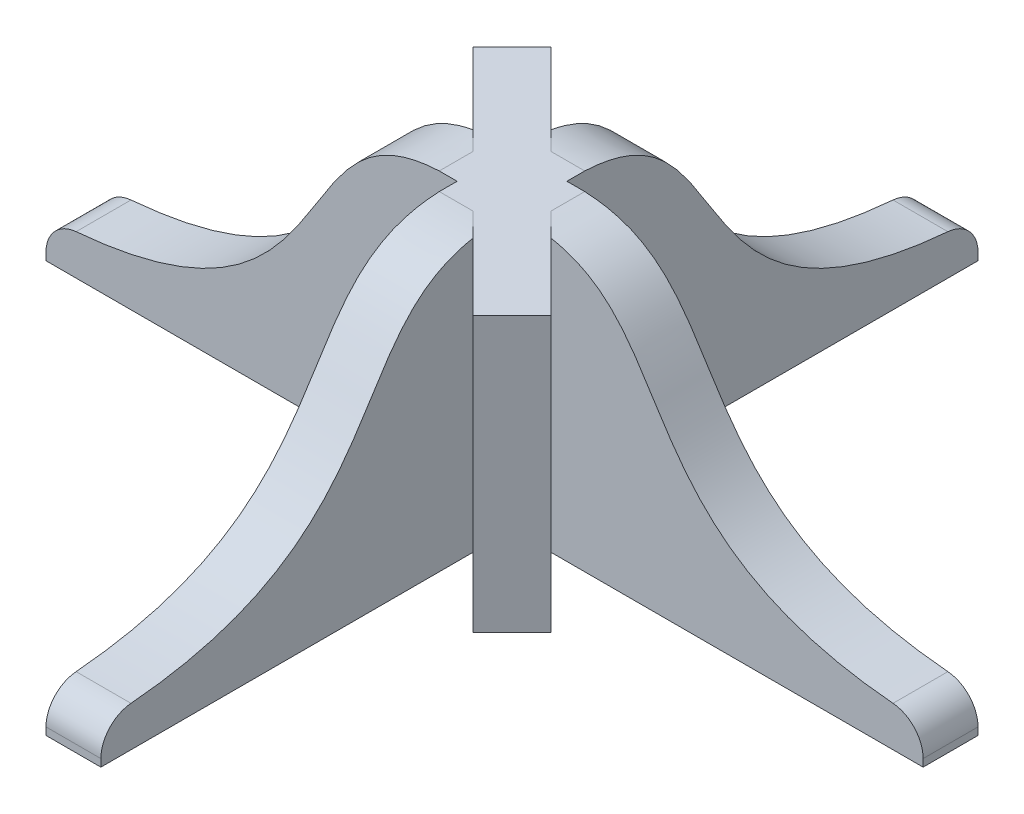
ISO-10303-21;
HEADER;
FILE_DESCRIPTION(('STEP AP214'),'2;1');
FILE_NAME('part.step','',(''),(''),'','','');
FILE_SCHEMA(('AUTOMOTIVE_DESIGN { 1 0 10303 214 1 1 1 1 }'));
ENDSEC;
DATA;
#1=APPLICATION_CONTEXT('core data for automotive mechanical design processes');
#2=APPLICATION_PROTOCOL_DEFINITION('international standard','automotive_design',2000,#1);
#3=PRODUCT_CONTEXT('',#1,'mechanical');
#4=PRODUCT('Part','Part','',(#3));
#5=PRODUCT_RELATED_PRODUCT_CATEGORY('part','',(#4));
#6=PRODUCT_DEFINITION_FORMATION('','',#4);
#7=PRODUCT_DEFINITION_CONTEXT('part definition',#1,'design');
#8=PRODUCT_DEFINITION('design','',#6,#7);
#9=PRODUCT_DEFINITION_SHAPE('','',#8);
#10=(LENGTH_UNIT() NAMED_UNIT(*) SI_UNIT(.MILLI.,.METRE.));
#11=(NAMED_UNIT(*) PLANE_ANGLE_UNIT() SI_UNIT($,.RADIAN.));
#12=(NAMED_UNIT(*) SI_UNIT($,.STERADIAN.) SOLID_ANGLE_UNIT());
#13=UNCERTAINTY_MEASURE_WITH_UNIT(LENGTH_MEASURE(1.E-05),#10,'distance_accuracy_value','');
#14=(GEOMETRIC_REPRESENTATION_CONTEXT(3) GLOBAL_UNCERTAINTY_ASSIGNED_CONTEXT((#13)) GLOBAL_UNIT_ASSIGNED_CONTEXT((#10,
#11,#12)) REPRESENTATION_CONTEXT('',''));
#15=CARTESIAN_POINT('',(0.,0.,0.));
#16=DIRECTION('',(0.,0.,1.));
#17=DIRECTION('',(1.,0.,0.));
#18=AXIS2_PLACEMENT_3D('',#15,#16,#17);
#19=CARTESIAN_POINT('',(2.5,25.,15.));
#20=DIRECTION('',(-1.,0.,0.));
#21=DIRECTION('',(0.,0.,1.));
#22=AXIS2_PLACEMENT_3D('',#19,#20,#21);
#23=PLANE('',#22);
#24=DIRECTION('',(0.,1.,0.));
#25=VECTOR('',#24,1.);
#26=CARTESIAN_POINT('',(2.5,0.,-39.9545926495664));
#27=LINE('',#26,#25);
#28=CARTESIAN_POINT('',(2.5,0.,-39.9545926495664));
#29=VERTEX_POINT('',#28);
#30=CARTESIAN_POINT('',(2.5,0.677844254713842,-39.9545926495664));
#31=VERTEX_POINT('',#30);
#32=EDGE_CURVE('E424',#29,#31,#27,.T.);
#33=ORIENTED_EDGE('',*,*,#32,.T.);
#34=CARTESIAN_POINT('',(2.5,0.677844254713842,-36.9545926495664));
#35=DIRECTION('',(-1.,0.,0.));
#36=DIRECTION('',(0.,0.,1.));
#37=AXIS2_PLACEMENT_3D('',#34,#35,#36);
#38=CIRCLE('',#37,3.);
#39=CARTESIAN_POINT('',(2.5,3.66674252680247,-37.2124436125384));
#40=VERTEX_POINT('',#39);
#41=EDGE_CURVE('E580',#31,#40,#38,.F.);
#42=ORIENTED_EDGE('',*,*,#41,.T.);
#43=CARTESIAN_POINT('',(2.5,3.5,-39.9545926495664));
#44=CARTESIAN_POINT('',(2.5,4.59068781406489,-10.398907099997));
#45=CARTESIAN_POINT('',(2.5,25.7140022080052,-19.5925722624361));
#46=CARTESIAN_POINT('',(2.5,25.,-2.49999999999992));
#47=B_SPLINE_CURVE_WITH_KNOTS('',3,(#43,#44,#45,#46),.UNSPECIFIED.,.F.,.F.,(4,4),(0.,1.),.UNSPECIFIED.);
#48=CARTESIAN_POINT('',(2.5,25.,-4.12758132705395));
#49=VERTEX_POINT('',#48);
#50=EDGE_CURVE('E423',#40,#49,#47,.T.);
#51=ORIENTED_EDGE('',*,*,#50,.T.);
#52=DIRECTION('',(0.,0.,-1.));
#53=VECTOR('',#52,1.);
#54=CARTESIAN_POINT('',(2.5,25.,0.));
#55=LINE('',#54,#53);
#56=CARTESIAN_POINT('',(2.5,25.,-2.5));
#57=VERTEX_POINT('',#56);
#58=EDGE_CURVE('E630',#57,#49,#55,.T.);
#59=ORIENTED_EDGE('',*,*,#58,.F.);
#60=DIRECTION('',(0.,1.,0.));
#61=VECTOR('',#60,1.);
#62=CARTESIAN_POINT('',(2.5,25.,-2.50000000000001));
#63=LINE('',#62,#61);
#64=CARTESIAN_POINT('',(2.5,0.,-2.5));
#65=VERTEX_POINT('',#64);
#66=EDGE_CURVE('E364',#65,#57,#63,.T.);
#67=ORIENTED_EDGE('',*,*,#66,.F.);
#68=DIRECTION('',(0.,0.,-1.));
#69=VECTOR('',#68,1.);
#70=CARTESIAN_POINT('',(2.5,0.,0.));
#71=LINE('',#70,#69);
#72=EDGE_CURVE('E640',#65,#29,#71,.T.);
#73=ORIENTED_EDGE('',*,*,#72,.T.);
#74=EDGE_LOOP('',(#33,#42,#51,#59,#67,#73));
#75=FACE_BOUND('',#74,.T.);
#76=ADVANCED_FACE('F136',(#75),#23,.F.);
#77=CARTESIAN_POINT('',(-1.76776695296637,0.,1.76776695296637));
#78=DIRECTION('',(-0.707106781186546,0.,0.707106781186549));
#79=DIRECTION('',(0.707106781186549,0.,0.707106781186546));
#80=AXIS2_PLACEMENT_3D('',#77,#78,#79);
#81=PLANE('',#80);
#82=DIRECTION('',(0.707106781186549,0.,0.707106781186546));
#83=VECTOR('',#82,1.);
#84=CARTESIAN_POINT('',(-12.3743686707646,0.,-8.83883476483182));
#85=LINE('',#84,#83);
#86=CARTESIAN_POINT('',(-12.3743686707646,0.,-8.83883476483182));
#87=VERTEX_POINT('',#86);
#88=CARTESIAN_POINT('',(-6.03553390593273,0.,-2.49999999999998));
#89=VERTEX_POINT('',#88);
#90=EDGE_CURVE('E375',#87,#89,#85,.T.);
#91=ORIENTED_EDGE('',*,*,#90,.T.);
#92=DIRECTION('',(0.,1.,0.));
#93=VECTOR('',#92,1.);
#94=CARTESIAN_POINT('',(-6.03553390593273,0.,-2.49999999999998));
#95=LINE('',#94,#93);
#96=CARTESIAN_POINT('',(-6.03553390989269,24.7911321666375,-2.49999999999998));
#97=VERTEX_POINT('',#96);
#98=EDGE_CURVE('E572',#89,#97,#95,.T.);
#99=ORIENTED_EDGE('',*,*,#98,.T.);
#100=CARTESIAN_POINT('',(-4.12758132690589,25.0000000000034,-0.592047420972992));
#101=CARTESIAN_POINT('',(-4.20734316558826,24.9963843751637,-0.671809259655455));
#102=CARTESIAN_POINT('',(-4.28709231995216,24.9921929748728,-0.751558414019398));
#103=CARTESIAN_POINT('',(-4.44652290779908,24.9826163361146,-0.910989001866349));
#104=CARTESIAN_POINT('',(-4.52620435560341,24.9772315737387,-0.990670449670671));
#105=CARTESIAN_POINT('',(-4.68549810718278,24.965224818639,-1.14996420125003));
#106=CARTESIAN_POINT('',(-4.76511042416571,24.9586031776077,-1.22957651823296));
#107=CARTESIAN_POINT('',(-4.92426412870012,24.9440766412828,-1.38873022276737));
#108=CARTESIAN_POINT('',(-5.00380552538779,24.9361719465794,-1.46827161945504));
#109=CARTESIAN_POINT('',(-5.16281982317982,24.9190306332631,-1.62728591724707));
#110=CARTESIAN_POINT('',(-5.24229272146655,24.9097939622663,-1.7067588155338));
#111=CARTESIAN_POINT('',(-5.40116226751207,24.8899384936853,-1.86562836157932));
#112=CARTESIAN_POINT('',(-5.48055890451985,24.8793195237965,-1.94502499858709));
#113=CARTESIAN_POINT('',(-5.63927225334025,24.8566466111186,-2.1037383474075));
#114=CARTESIAN_POINT('',(-5.71858893671162,24.8445922692379,-2.18305503077886));
#115=CARTESIAN_POINT('',(-5.87713808017222,24.818992893705,-2.34160417423947));
#116=CARTESIAN_POINT('',(-5.95637048615244,24.8054471902862,-2.4208365802197));
#117=CARTESIAN_POINT('',(-6.03553390990431,24.7911321666354,-2.50000000397158));
#118=B_SPLINE_CURVE_WITH_KNOTS('',3,(#100,#101,#102,#103,#104,#105,#106,#107,#108,#109,#110,
#111,#112,#113,#114,#115,#116,#117),.UNSPECIFIED.,.F.,.F.,(4,2,2,2,2,2,2,2,4),(0.,
0.338573908695255,0.677012985757939,1.0153559775485,1.35364612430561,1.69194957893252,
2.03029524375751,2.36873520299648,2.7073277795596),.UNSPECIFIED.);
#119=CARTESIAN_POINT('',(-4.12758132690581,25.,-0.592047420973067));
#120=VERTEX_POINT('',#119);
#121=EDGE_CURVE('E565',#120,#97,#118,.T.);
#122=ORIENTED_EDGE('',*,*,#121,.F.);
#123=DIRECTION('',(-0.707106781186549,0.,-0.707106781186546));
#124=VECTOR('',#123,1.);
#125=CARTESIAN_POINT('',(-12.3743686707646,25.,-8.83883476483182));
#126=LINE('',#125,#124);
#127=CARTESIAN_POINT('',(-12.3743686707646,25.,-8.83883476483182));
#128=VERTEX_POINT('',#127);
#129=EDGE_CURVE('E324',#120,#128,#126,.T.);
#130=ORIENTED_EDGE('',*,*,#129,.T.);
#131=DIRECTION('',(0.,-1.,0.));
#132=VECTOR('',#131,1.);
#133=CARTESIAN_POINT('',(-12.3743686707646,25.,-8.83883476483182));
#134=LINE('',#133,#132);
#135=EDGE_CURVE('E369',#128,#87,#134,.T.);
#136=ORIENTED_EDGE('',*,*,#135,.T.);
#137=EDGE_LOOP('',(#91,#99,#122,#130,#136));
#138=FACE_BOUND('',#137,.T.);
#139=ADVANCED_FACE('F500',(#138),#81,.T.);
#140=CARTESIAN_POINT('',(-2.5,25.,15.));
#141=DIRECTION('',(-1.,0.,0.));
#142=DIRECTION('',(0.,0.,1.));
#143=AXIS2_PLACEMENT_3D('',#140,#141,#142);
#144=PLANE('',#143);
#145=CARTESIAN_POINT('',(-2.5,3.5,-39.9545926495664));
#146=CARTESIAN_POINT('',(-2.5,4.59068781406489,-10.398907099997));
#147=CARTESIAN_POINT('',(-2.5,25.7140022080052,-19.5925722624361));
#148=CARTESIAN_POINT('',(-2.5,25.,-2.49999999999992));
#149=B_SPLINE_CURVE_WITH_KNOTS('',3,(#145,#146,#147,#148),.UNSPECIFIED.,.F.,.F.,(4,4),(0.,1.),.UNSPECIFIED.);
#150=CARTESIAN_POINT('',(-2.5,3.66674252680247,-37.2124436125384));
#151=VERTEX_POINT('',#150);
#152=CARTESIAN_POINT('',(-2.50000000197772,24.7911321659231,-6.03553391186589));
#153=VERTEX_POINT('',#152);
#154=EDGE_CURVE('E433',#151,#153,#149,.T.);
#155=ORIENTED_EDGE('',*,*,#154,.F.);
#156=CARTESIAN_POINT('',(-2.5,0.677844254713842,-36.9545926495664));
#157=DIRECTION('',(-1.,0.,0.));
#158=DIRECTION('',(0.,0.,1.));
#159=AXIS2_PLACEMENT_3D('',#156,#157,#158);
#160=CIRCLE('',#159,3.);
#161=CARTESIAN_POINT('',(-2.5,0.677844254713842,-39.9545926495664));
#162=VERTEX_POINT('',#161);
#163=EDGE_CURVE('E586',#151,#162,#160,.T.);
#164=ORIENTED_EDGE('',*,*,#163,.T.);
#165=DIRECTION('',(0.,1.,0.));
#166=VECTOR('',#165,1.);
#167=CARTESIAN_POINT('',(-2.5,0.,-39.9545926495664));
#168=LINE('',#167,#166);
#169=CARTESIAN_POINT('',(-2.5,0.,-39.9545926495664));
#170=VERTEX_POINT('',#169);
#171=EDGE_CURVE('E442',#170,#162,#168,.T.);
#172=ORIENTED_EDGE('',*,*,#171,.F.);
#173=DIRECTION('',(0.,0.,-1.));
#174=VECTOR('',#173,1.);
#175=CARTESIAN_POINT('',(-2.5,0.,0.));
#176=LINE('',#175,#174);
#177=CARTESIAN_POINT('',(-2.5,0.,-6.03553390593273));
#178=VERTEX_POINT('',#177);
#179=EDGE_CURVE('E646',#178,#170,#176,.T.);
#180=ORIENTED_EDGE('',*,*,#179,.F.);
#181=DIRECTION('',(0.,1.,0.));
#182=VECTOR('',#181,1.);
#183=CARTESIAN_POINT('',(-2.5,25.,-6.03553390593272));
#184=LINE('',#183,#182);
#185=EDGE_CURVE('E415',#178,#153,#184,.T.);
#186=ORIENTED_EDGE('',*,*,#185,.T.);
#187=EDGE_LOOP('',(#155,#164,#172,#180,#186));
#188=FACE_BOUND('',#187,.T.);
#189=ADVANCED_FACE('F467',(#188),#144,.T.);
#190=CARTESIAN_POINT('',(-32.897536702704,3.5,-39.9545926495664));
#191=CARTESIAN_POINT('',(-32.897536702704,4.59068781406489,-10.398907099997));
#192=CARTESIAN_POINT('',(-32.897536702704,25.7140022080052,-19.5925722624361));
#193=CARTESIAN_POINT('',(-32.897536702704,25.,-2.49999999999992));
#194=B_SPLINE_CURVE_WITH_KNOTS('',3,(#190,#191,#192,#193),.UNSPECIFIED.,.F.,.F.,(4,4),(0.,1.),.UNSPECIFIED.);
#195=DIRECTION('',(1.,0.,0.));
#196=VECTOR('',#195,1.);
#197=SURFACE_OF_LINEAR_EXTRUSION('',#194,#196);
#198=ORIENTED_EDGE('',*,*,#50,.F.);
#199=DIRECTION('',(1.,0.,0.));
#200=VECTOR('',#199,1.);
#201=CARTESIAN_POINT('',(2.5,3.66674252680247,-37.2124436125384));
#202=LINE('',#201,#200);
#203=EDGE_CURVE('E583',#40,#151,#202,.F.);
#204=ORIENTED_EDGE('',*,*,#203,.T.);
#205=ORIENTED_EDGE('',*,*,#154,.T.);
#206=CARTESIAN_POINT('',(-2.50000000197772,24.7911321659231,-6.03553391186589));
#207=CARTESIAN_POINT('',(-2.42083657959755,24.8054471900138,-5.95637048695043));
#208=CARTESIAN_POINT('',(-2.34160417421857,24.8189928936075,-5.87713808053174));
#209=CARTESIAN_POINT('',(-2.18305503128428,24.8445922692571,-5.71858893683673));
#210=CARTESIAN_POINT('',(-2.10373834783829,24.8566466110799,-5.63927225366913));
#211=CARTESIAN_POINT('',(-1.9450249990506,24.8793195237074,-5.48055890508518));
#212=CARTESIAN_POINT('',(-1.86562836215011,24.8899384936035,-5.40116226811012));
#213=CARTESIAN_POINT('',(-1.70675881627052,24.9097939621847,-5.24229272217596));
#214=CARTESIAN_POINT('',(-1.62728591804243,24.9190306331742,-5.16281982396784));
#215=CARTESIAN_POINT('',(-1.46827162038159,24.9361719464826,-5.00380552632163));
#216=CARTESIAN_POINT('',(-1.38873022376646,24.9440766411854,-4.92426412970115));
#217=CARTESIAN_POINT('',(-1.22957651937324,24.9586031775099,-4.765110425304));
#218=CARTESIAN_POINT('',(-1.14996420245896,24.9652248185415,-4.68549810839112));
#219=CARTESIAN_POINT('',(-0.99067045101733,24.9772315736437,-4.52620435695062));
#220=CARTESIAN_POINT('',(-0.910989003282091,24.9826163360217,-4.4465229092151));
#221=CARTESIAN_POINT('',(-0.751558415572945,24.9921929747873,-4.28709232150539));
#222=CARTESIAN_POINT('',(-0.671809261277726,24.9963843750833,-4.20734316720989));
#223=CARTESIAN_POINT('',(-0.592047422663604,24.9999999999301,-4.12758132859633));
#224=B_SPLINE_CURVE_WITH_KNOTS('',3,(#206,#207,#208,#209,#210,#211,#212,#213,#214,#215,#216,
#217,#218,#219,#220,#221,#222,#223),.UNSPECIFIED.,.F.,.F.,(4,2,2,2,2,2,2,2,4),(0.,
0.338592576283326,0.677032535229365,1.01537819976182,1.35368165409636,1.69197180055779,
2.03031479205464,2.36875386882549,2.70732777723066),.UNSPECIFIED.);
#225=CARTESIAN_POINT('',(-0.592047421121176,25.,-4.12758132705391));
#226=VERTEX_POINT('',#225);
#227=EDGE_CURVE('E474',#153,#226,#224,.T.);
#228=ORIENTED_EDGE('',*,*,#227,.T.);
#229=DIRECTION('',(1.,0.,0.));
#230=VECTOR('',#229,1.);
#231=CARTESIAN_POINT('',(-15.,25.,-4.12758132705391));
#232=LINE('',#231,#230);
#233=EDGE_CURVE('E485',#49,#226,#232,.F.);
#234=ORIENTED_EDGE('',*,*,#233,.F.);
#235=EDGE_LOOP('',(#198,#204,#205,#228,#234));
#236=FACE_BOUND('',#235,.T.);
#237=ADVANCED_FACE('F462',(#236),#197,.T.);
#238=CARTESIAN_POINT('',(0.,25.,0.));
#239=DIRECTION('',(0.,1.,0.));
#240=DIRECTION('',(0.,0.,1.));
#241=AXIS2_PLACEMENT_3D('',#238,#239,#240);
#242=PLANE('',#241);
#243=DIRECTION('',(-1.,0.,0.));
#244=VECTOR('',#243,1.);
#245=CARTESIAN_POINT('',(0.,25.,2.5));
#246=LINE('',#245,#244);
#247=CARTESIAN_POINT('',(-2.5,25.,2.50000000000001));
#248=VERTEX_POINT('',#247);
#249=CARTESIAN_POINT('',(-4.12758132705394,25.,2.50000000000002));
#250=VERTEX_POINT('',#249);
#251=EDGE_CURVE('E322',#248,#250,#246,.T.);
#252=ORIENTED_EDGE('',*,*,#251,.F.);
#253=DIRECTION('',(0.,0.,-1.));
#254=VECTOR('',#253,1.);
#255=CARTESIAN_POINT('',(-2.5,25.,0.));
#256=LINE('',#255,#254);
#257=CARTESIAN_POINT('',(-2.5,25.,4.12758132705395));
#258=VERTEX_POINT('',#257);
#259=EDGE_CURVE('E633',#258,#248,#256,.T.);
#260=ORIENTED_EDGE('',*,*,#259,.F.);
#261=DIRECTION('',(1.,0.,0.));
#262=VECTOR('',#261,1.);
#263=CARTESIAN_POINT('',(-15.,25.,4.12758132705395));
#264=LINE('',#263,#262);
#265=CARTESIAN_POINT('',(0.59204742112122,25.,4.12758132705395));
#266=VERTEX_POINT('',#265);
#267=EDGE_CURVE('E652',#258,#266,#264,.T.);
#268=ORIENTED_EDGE('',*,*,#267,.T.);
#269=CARTESIAN_POINT('',(8.83883476483187,25.,12.3743686707646));
#270=VERTEX_POINT('',#269);
#271=EDGE_CURVE('E381',#270,#266,#126,.T.);
#272=ORIENTED_EDGE('',*,*,#271,.F.);
#273=DIRECTION('',(0.707106781186546,0.,-0.707106781186549));
#274=VECTOR('',#273,1.);
#275=CARTESIAN_POINT('',(8.83883476483187,25.,12.3743686707646));
#276=LINE('',#275,#274);
#277=CARTESIAN_POINT('',(12.3743686707646,25.,8.83883476483182));
#278=VERTEX_POINT('',#277);
#279=EDGE_CURVE('E403',#270,#278,#276,.T.);
#280=ORIENTED_EDGE('',*,*,#279,.T.);
#281=DIRECTION('',(-0.707106781186549,0.,-0.707106781186546));
#282=VECTOR('',#281,1.);
#283=CARTESIAN_POINT('',(-8.83883476483187,25.,-12.3743686707646));
#284=LINE('',#283,#282);
#285=CARTESIAN_POINT('',(4.12758132705373,25.,0.592047421120977));
#286=VERTEX_POINT('',#285);
#287=EDGE_CURVE('E374',#278,#286,#284,.T.);
#288=ORIENTED_EDGE('',*,*,#287,.T.);
#289=DIRECTION('',(0.,0.,-1.));
#290=VECTOR('',#289,1.);
#291=CARTESIAN_POINT('',(4.127581327054,25.,15.));
#292=LINE('',#291,#290);
#293=CARTESIAN_POINT('',(4.12758132705394,25.,-2.50000000000001));
#294=VERTEX_POINT('',#293);
#295=EDGE_CURVE('E531',#286,#294,#292,.T.);
#296=ORIENTED_EDGE('',*,*,#295,.T.);
#297=DIRECTION('',(-1.,0.,0.));
#298=VECTOR('',#297,1.);
#299=CARTESIAN_POINT('',(0.,25.,-2.5));
#300=LINE('',#299,#298);
#301=EDGE_CURVE('E333',#294,#57,#300,.T.);
#302=ORIENTED_EDGE('',*,*,#301,.T.);
#303=ORIENTED_EDGE('',*,*,#58,.T.);
#304=ORIENTED_EDGE('',*,*,#233,.T.);
#305=CARTESIAN_POINT('',(-8.83883476483187,25.,-12.3743686707646));
#306=VERTEX_POINT('',#305);
#307=EDGE_CURVE('E396',#226,#306,#284,.T.);
#308=ORIENTED_EDGE('',*,*,#307,.T.);
#309=DIRECTION('',(0.707106781186546,0.,-0.707106781186549));
#310=VECTOR('',#309,1.);
#311=CARTESIAN_POINT('',(-12.3743686707646,25.,-8.83883476483182));
#312=LINE('',#311,#310);
#313=EDGE_CURVE('E384',#128,#306,#312,.T.);
#314=ORIENTED_EDGE('',*,*,#313,.F.);
#315=ORIENTED_EDGE('',*,*,#129,.F.);
#316=DIRECTION('',(0.,0.,-1.));
#317=VECTOR('',#316,1.);
#318=CARTESIAN_POINT('',(-4.12758132705385,25.,15.));
#319=LINE('',#318,#317);
#320=EDGE_CURVE('E310',#120,#250,#319,.F.);
#321=ORIENTED_EDGE('',*,*,#320,.T.);
#322=EDGE_LOOP('',(#252,#260,#268,#272,#280,#288,#296,#302,#303,#304,#308,#314,#315,#321));
#323=FACE_BOUND('',#322,.T.);
#324=ADVANCED_FACE('F321',(#323),#242,.T.);
#325=CARTESIAN_POINT('',(0.,0.,0.));
#326=DIRECTION('',(0.,1.,0.));
#327=DIRECTION('',(0.,0.,1.));
#328=AXIS2_PLACEMENT_3D('',#325,#326,#327);
#329=PLANE('',#328);
#330=ORIENTED_EDGE('',*,*,#72,.F.);
#331=DIRECTION('',(-1.,0.,0.));
#332=VECTOR('',#331,1.);
#333=CARTESIAN_POINT('',(0.,0.,-2.5));
#334=LINE('',#333,#332);
#335=CARTESIAN_POINT('',(39.9545926495664,0.,-2.50000000000014));
#336=VERTEX_POINT('',#335);
#337=EDGE_CURVE('E334',#336,#65,#334,.T.);
#338=ORIENTED_EDGE('',*,*,#337,.F.);
#339=DIRECTION('',(0.,0.,-1.));
#340=VECTOR('',#339,1.);
#341=CARTESIAN_POINT('',(39.9545926495665,0.,32.8975367027039));
#342=LINE('',#341,#340);
#343=CARTESIAN_POINT('',(39.9545926495664,0.,2.49999999999986));
#344=VERTEX_POINT('',#343);
#345=EDGE_CURVE('E315',#344,#336,#342,.T.);
#346=ORIENTED_EDGE('',*,*,#345,.F.);
#347=DIRECTION('',(-1.,0.,0.));
#348=VECTOR('',#347,1.);
#349=CARTESIAN_POINT('',(0.,0.,2.5));
#350=LINE('',#349,#348);
#351=CARTESIAN_POINT('',(6.03553390593273,0.,2.49999999999998));
#352=VERTEX_POINT('',#351);
#353=EDGE_CURVE('E349',#344,#352,#350,.T.);
#354=ORIENTED_EDGE('',*,*,#353,.T.);
#355=DIRECTION('',(0.707106781186549,0.,0.707106781186546));
#356=VECTOR('',#355,1.);
#357=CARTESIAN_POINT('',(-8.83883476483186,0.,-12.3743686707646));
#358=LINE('',#357,#356);
#359=CARTESIAN_POINT('',(12.3743686707646,0.,8.83883476483182));
#360=VERTEX_POINT('',#359);
#361=EDGE_CURVE('E388',#352,#360,#358,.T.);
#362=ORIENTED_EDGE('',*,*,#361,.T.);
#363=DIRECTION('',(0.707106781186546,0.,-0.707106781186549));
#364=VECTOR('',#363,1.);
#365=CARTESIAN_POINT('',(8.83883476483186,0.,12.3743686707646));
#366=LINE('',#365,#364);
#367=CARTESIAN_POINT('',(8.83883476483186,0.,12.3743686707646));
#368=VERTEX_POINT('',#367);
#369=EDGE_CURVE('E407',#368,#360,#366,.T.);
#370=ORIENTED_EDGE('',*,*,#369,.F.);
#371=CARTESIAN_POINT('',(2.5,0.,6.03553390593272));
#372=VERTEX_POINT('',#371);
#373=EDGE_CURVE('E373',#372,#368,#85,.T.);
#374=ORIENTED_EDGE('',*,*,#373,.F.);
#375=CARTESIAN_POINT('',(2.5,0.,39.9545926495664));
#376=VERTEX_POINT('',#375);
#377=EDGE_CURVE('E636',#376,#372,#71,.T.);
#378=ORIENTED_EDGE('',*,*,#377,.F.);
#379=DIRECTION('',(1.,0.,0.));
#380=VECTOR('',#379,1.);
#381=CARTESIAN_POINT('',(-32.897536702704,0.,39.9545926495664));
#382=LINE('',#381,#380);
#383=CARTESIAN_POINT('',(-2.5,0.,39.9545926495664));
#384=VERTEX_POINT('',#383);
#385=EDGE_CURVE('E441',#384,#376,#382,.T.);
#386=ORIENTED_EDGE('',*,*,#385,.F.);
#387=CARTESIAN_POINT('',(-2.5,0.,2.50000000000001));
#388=VERTEX_POINT('',#387);
#389=EDGE_CURVE('E643',#384,#388,#176,.T.);
#390=ORIENTED_EDGE('',*,*,#389,.T.);
#391=CARTESIAN_POINT('',(-39.9545926495664,0.,2.50000000000014));
#392=VERTEX_POINT('',#391);
#393=EDGE_CURVE('E352',#388,#392,#350,.T.);
#394=ORIENTED_EDGE('',*,*,#393,.T.);
#395=DIRECTION('',(0.,0.,-1.));
#396=VECTOR('',#395,1.);
#397=CARTESIAN_POINT('',(-39.9545926495662,0.,32.8975367027041));
#398=LINE('',#397,#396);
#399=CARTESIAN_POINT('',(-39.9545926495664,0.,-2.49999999999986));
#400=VERTEX_POINT('',#399);
#401=EDGE_CURVE('E555',#392,#400,#398,.T.);
#402=ORIENTED_EDGE('',*,*,#401,.T.);
#403=EDGE_CURVE('E341',#89,#400,#334,.T.);
#404=ORIENTED_EDGE('',*,*,#403,.F.);
#405=ORIENTED_EDGE('',*,*,#90,.F.);
#406=DIRECTION('',(0.707106781186546,0.,-0.707106781186549));
#407=VECTOR('',#406,1.);
#408=CARTESIAN_POINT('',(-12.3743686707646,0.,-8.83883476483182));
#409=LINE('',#408,#407);
#410=CARTESIAN_POINT('',(-8.83883476483186,0.,-12.3743686707646));
#411=VERTEX_POINT('',#410);
#412=EDGE_CURVE('E411',#87,#411,#409,.T.);
#413=ORIENTED_EDGE('',*,*,#412,.T.);
#414=EDGE_CURVE('E389',#411,#178,#358,.T.);
#415=ORIENTED_EDGE('',*,*,#414,.T.);
#416=ORIENTED_EDGE('',*,*,#179,.T.);
#417=DIRECTION('',(1.,0.,0.));
#418=VECTOR('',#417,1.);
#419=CARTESIAN_POINT('',(-32.897536702704,0.,-39.9545926495664));
#420=LINE('',#419,#418);
#421=EDGE_CURVE('E428',#170,#29,#420,.T.);
#422=ORIENTED_EDGE('',*,*,#421,.T.);
#423=EDGE_LOOP('',(#330,#338,#346,#354,#362,#370,#374,#378,#386,#390,#394,#402,#404,#405,#413,
#415,#416,#422));
#424=FACE_BOUND('',#423,.T.);
#425=ADVANCED_FACE('F671',(#424),#329,.F.);
#426=CARTESIAN_POINT('',(2.5,3.5,39.9545926495664));
#427=CARTESIAN_POINT('',(2.5,4.59068781406489,10.398907099997));
#428=CARTESIAN_POINT('',(2.5,25.7140022080052,19.5925722624361));
#429=CARTESIAN_POINT('',(2.5,25.,2.49999999999992));
#430=B_SPLINE_CURVE_WITH_KNOTS('',3,(#426,#427,#428,#429),.UNSPECIFIED.,.F.,.F.,(4,4),(0.,1.),.UNSPECIFIED.);
#431=CARTESIAN_POINT('',(2.50000000197772,24.7911321659231,6.03553391186589));
#432=VERTEX_POINT('',#431);
#433=CARTESIAN_POINT('',(2.5,3.66674252680247,37.2124436125384));
#434=VERTEX_POINT('',#433);
#435=EDGE_CURVE('E649',#432,#434,#430,.F.);
#436=ORIENTED_EDGE('',*,*,#435,.T.);
#437=CARTESIAN_POINT('',(2.5,0.677844254713842,36.9545926495664));
#438=DIRECTION('',(-1.,0.,0.));
#439=DIRECTION('',(0.,0.,1.));
#440=AXIS2_PLACEMENT_3D('',#437,#438,#439);
#441=CIRCLE('',#440,3.);
#442=CARTESIAN_POINT('',(2.5,0.677844254713842,39.9545926495664));
#443=VERTEX_POINT('',#442);
#444=EDGE_CURVE('E606',#434,#443,#441,.F.);
#445=ORIENTED_EDGE('',*,*,#444,.T.);
#446=DIRECTION('',(0.,1.,0.));
#447=VECTOR('',#446,1.);
#448=CARTESIAN_POINT('',(2.5,0.,39.9545926495664));
#449=LINE('',#448,#447);
#450=EDGE_CURVE('E456',#376,#443,#449,.T.);
#451=ORIENTED_EDGE('',*,*,#450,.F.);
#452=ORIENTED_EDGE('',*,*,#377,.T.);
#453=DIRECTION('',(0.,1.,0.));
#454=VECTOR('',#453,1.);
#455=CARTESIAN_POINT('',(2.5,25.,6.03553390593272));
#456=LINE('',#455,#454);
#457=EDGE_CURVE('E419',#372,#432,#456,.T.);
#458=ORIENTED_EDGE('',*,*,#457,.T.);
#459=EDGE_LOOP('',(#436,#445,#451,#452,#458));
#460=FACE_BOUND('',#459,.T.);
#461=ADVANCED_FACE('F749',(#460),#23,.F.);
#462=DIRECTION('',(0.,1.,0.));
#463=VECTOR('',#462,1.);
#464=CARTESIAN_POINT('',(-2.5,0.,39.9545926495664));
#465=LINE('',#464,#463);
#466=CARTESIAN_POINT('',(-2.5,0.677844254713842,39.9545926495664));
#467=VERTEX_POINT('',#466);
#468=EDGE_CURVE('E656',#384,#467,#465,.T.);
#469=ORIENTED_EDGE('',*,*,#468,.T.);
#470=CARTESIAN_POINT('',(-2.5,0.677844254713842,36.9545926495664));
#471=DIRECTION('',(-1.,0.,0.));
#472=DIRECTION('',(0.,0.,1.));
#473=AXIS2_PLACEMENT_3D('',#470,#471,#472);
#474=CIRCLE('',#473,3.);
#475=CARTESIAN_POINT('',(-2.5,3.66674252680247,37.2124436125384));
#476=VERTEX_POINT('',#475);
#477=EDGE_CURVE('E612',#467,#476,#474,.T.);
#478=ORIENTED_EDGE('',*,*,#477,.T.);
#479=CARTESIAN_POINT('',(-2.5,3.5,39.9545926495664));
#480=CARTESIAN_POINT('',(-2.5,4.59068781406489,10.398907099997));
#481=CARTESIAN_POINT('',(-2.5,25.7140022080052,19.5925722624361));
#482=CARTESIAN_POINT('',(-2.5,25.,2.49999999999992));
#483=B_SPLINE_CURVE_WITH_KNOTS('',3,(#479,#480,#481,#482),.UNSPECIFIED.,.F.,.F.,(4,4),(0.,1.),.UNSPECIFIED.);
#484=EDGE_CURVE('E627',#258,#476,#483,.F.);
#485=ORIENTED_EDGE('',*,*,#484,.F.);
#486=ORIENTED_EDGE('',*,*,#259,.T.);
#487=DIRECTION('',(0.,1.,0.));
#488=VECTOR('',#487,1.);
#489=CARTESIAN_POINT('',(-2.5,25.,2.50000000000001));
#490=LINE('',#489,#488);
#491=EDGE_CURVE('E326',#388,#248,#490,.T.);
#492=ORIENTED_EDGE('',*,*,#491,.F.);
#493=ORIENTED_EDGE('',*,*,#389,.F.);
#494=EDGE_LOOP('',(#469,#478,#485,#486,#492,#493));
#495=FACE_BOUND('',#494,.T.);
#496=ADVANCED_FACE('F739',(#495),#144,.T.);
#497=CARTESIAN_POINT('',(-15.,3.5,39.9545926495664));
#498=CARTESIAN_POINT('',(-15.,4.59068781406489,10.398907099997));
#499=CARTESIAN_POINT('',(-15.,25.7140022080052,19.5925722624361));
#500=CARTESIAN_POINT('',(-15.,25.,2.49999999999992));
#501=B_SPLINE_CURVE_WITH_KNOTS('',3,(#497,#498,#499,#500),.UNSPECIFIED.,.F.,.F.,(4,4),(0.,1.),.UNSPECIFIED.);
#502=DIRECTION('',(1.,0.,0.));
#503=VECTOR('',#502,1.);
#504=SURFACE_OF_LINEAR_EXTRUSION('',#501,#503);
#505=ORIENTED_EDGE('',*,*,#484,.T.);
#506=DIRECTION('',(1.,0.,0.));
#507=VECTOR('',#506,1.);
#508=CARTESIAN_POINT('',(-2.5,3.66674252680247,37.2124436125384));
#509=LINE('',#508,#507);
#510=EDGE_CURVE('E602',#476,#434,#509,.T.);
#511=ORIENTED_EDGE('',*,*,#510,.T.);
#512=ORIENTED_EDGE('',*,*,#435,.F.);
#513=CARTESIAN_POINT('',(2.50000000197772,24.7911321659231,6.03553391186589));
#514=CARTESIAN_POINT('',(2.42083657959755,24.8054471900138,5.95637048695043));
#515=CARTESIAN_POINT('',(2.34160417421857,24.8189928936075,5.87713808053174));
#516=CARTESIAN_POINT('',(2.18305503128428,24.8445922692571,5.71858893683673));
#517=CARTESIAN_POINT('',(2.10373834783829,24.8566466110799,5.63927225366913));
#518=CARTESIAN_POINT('',(1.9450249990506,24.8793195237074,5.48055890508518));
#519=CARTESIAN_POINT('',(1.86562836215011,24.8899384936035,5.40116226811012));
#520=CARTESIAN_POINT('',(1.70675881627052,24.9097939621847,5.24229272217595));
#521=CARTESIAN_POINT('',(1.62728591804242,24.9190306331742,5.16281982396783));
#522=CARTESIAN_POINT('',(1.46827162038158,24.9361719464826,5.00380552632162));
#523=CARTESIAN_POINT('',(1.38873022376645,24.9440766411854,4.92426412970115));
#524=CARTESIAN_POINT('',(1.22957651937324,24.9586031775099,4.76511042530399));
#525=CARTESIAN_POINT('',(1.14996420245895,24.9652248185415,4.68549810839112));
#526=CARTESIAN_POINT('',(0.990670451017325,24.9772315736437,4.52620435695062));
#527=CARTESIAN_POINT('',(0.910989003282085,24.9826163360217,4.44652290921509));
#528=CARTESIAN_POINT('',(0.751558415572939,24.9921929747873,4.28709232150539));
#529=CARTESIAN_POINT('',(0.671809261277719,24.9963843750833,4.20734316720988));
#530=CARTESIAN_POINT('',(0.592047422663595,24.9999999999301,4.12758132859632));
#531=B_SPLINE_CURVE_WITH_KNOTS('',3,(#513,#514,#515,#516,#517,#518,#519,#520,#521,#522,#523,
#524,#525,#526,#527,#528,#529,#530),.UNSPECIFIED.,.F.,.F.,(4,2,2,2,2,2,2,2,4),(0.,
0.338592576283327,0.677032535229367,1.01537819976183,1.35368165409637,1.69197180055779,
2.03031479205465,2.3687538688255,2.70732777723067),.UNSPECIFIED.);
#532=EDGE_CURVE('E484',#432,#266,#531,.T.);
#533=ORIENTED_EDGE('',*,*,#532,.T.);
#534=ORIENTED_EDGE('',*,*,#267,.F.);
#535=EDGE_LOOP('',(#505,#511,#512,#533,#534));
#536=FACE_BOUND('',#535,.T.);
#537=ADVANCED_FACE('F744',(#536),#504,.F.);
#538=CARTESIAN_POINT('',(-32.897536702704,0.,39.9545926495664));
#539=DIRECTION('',(0.,0.,-1.));
#540=DIRECTION('',(-1.,0.,0.));
#541=AXIS2_PLACEMENT_3D('',#538,#539,#540);
#542=PLANE('',#541);
#543=ORIENTED_EDGE('',*,*,#450,.T.);
#544=DIRECTION('',(1.,0.,0.));
#545=VECTOR('',#544,1.);
#546=CARTESIAN_POINT('',(-32.897536702704,0.677844254713842,39.9545926495664));
#547=LINE('',#546,#545);
#548=EDGE_CURVE('E609',#443,#467,#547,.F.);
#549=ORIENTED_EDGE('',*,*,#548,.T.);
#550=ORIENTED_EDGE('',*,*,#468,.F.);
#551=ORIENTED_EDGE('',*,*,#385,.T.);
#552=EDGE_LOOP('',(#543,#549,#550,#551));
#553=FACE_BOUND('',#552,.T.);
#554=ADVANCED_FACE('F752',(#553),#542,.F.);
#555=CARTESIAN_POINT('',(-32.897536702704,0.,-39.9545926495664));
#556=DIRECTION('',(0.,0.,-1.));
#557=DIRECTION('',(-1.,0.,0.));
#558=AXIS2_PLACEMENT_3D('',#555,#556,#557);
#559=PLANE('',#558);
#560=ORIENTED_EDGE('',*,*,#171,.T.);
#561=DIRECTION('',(1.,0.,0.));
#562=VECTOR('',#561,1.);
#563=CARTESIAN_POINT('',(-32.897536702704,0.677844254713842,-39.9545926495664));
#564=LINE('',#563,#562);
#565=EDGE_CURVE('E576',#162,#31,#564,.T.);
#566=ORIENTED_EDGE('',*,*,#565,.T.);
#567=ORIENTED_EDGE('',*,*,#32,.F.);
#568=ORIENTED_EDGE('',*,*,#421,.F.);
#569=EDGE_LOOP('',(#560,#566,#567,#568));
#570=FACE_BOUND('',#569,.T.);
#571=ADVANCED_FACE('F471',(#570),#559,.T.);
#572=CARTESIAN_POINT('',(-12.3743686707646,25.,-8.83883476483182));
#573=DIRECTION('',(0.707106781186549,0.,0.707106781186546));
#574=DIRECTION('',(0.707106781186546,0.,-0.707106781186549));
#575=AXIS2_PLACEMENT_3D('',#572,#573,#574);
#576=PLANE('',#575);
#577=DIRECTION('',(0.,-1.,0.));
#578=VECTOR('',#577,1.);
#579=CARTESIAN_POINT('',(-8.83883476483187,25.,-12.3743686707646));
#580=LINE('',#579,#578);
#581=EDGE_CURVE('E368',#306,#411,#580,.T.);
#582=ORIENTED_EDGE('',*,*,#581,.T.);
#583=ORIENTED_EDGE('',*,*,#412,.F.);
#584=ORIENTED_EDGE('',*,*,#135,.F.);
#585=ORIENTED_EDGE('',*,*,#313,.T.);
#586=EDGE_LOOP('',(#582,#583,#584,#585));
#587=FACE_BOUND('',#586,.T.);
#588=ADVANCED_FACE('F469',(#587),#576,.F.);
#589=CARTESIAN_POINT('',(1.76776695296637,0.,-1.76776695296637));
#590=DIRECTION('',(-0.707106781186546,0.,0.707106781186549));
#591=DIRECTION('',(0.707106781186549,0.,0.707106781186546));
#592=AXIS2_PLACEMENT_3D('',#589,#590,#591);
#593=PLANE('',#592);
#594=ORIENTED_EDGE('',*,*,#185,.F.);
#595=ORIENTED_EDGE('',*,*,#414,.F.);
#596=ORIENTED_EDGE('',*,*,#581,.F.);
#597=ORIENTED_EDGE('',*,*,#307,.F.);
#598=ORIENTED_EDGE('',*,*,#227,.F.);
#599=EDGE_LOOP('',(#594,#595,#596,#597,#598));
#600=FACE_BOUND('',#599,.T.);
#601=ADVANCED_FACE('F494',(#600),#593,.F.);
#602=ORIENTED_EDGE('',*,*,#457,.F.);
#603=ORIENTED_EDGE('',*,*,#373,.T.);
#604=DIRECTION('',(0.,1.,0.));
#605=VECTOR('',#604,1.);
#606=CARTESIAN_POINT('',(8.83883476483187,25.,12.3743686707646));
#607=LINE('',#606,#605);
#608=EDGE_CURVE('E378',#368,#270,#607,.T.);
#609=ORIENTED_EDGE('',*,*,#608,.T.);
#610=ORIENTED_EDGE('',*,*,#271,.T.);
#611=ORIENTED_EDGE('',*,*,#532,.F.);
#612=EDGE_LOOP('',(#602,#603,#609,#610,#611));
#613=FACE_BOUND('',#612,.T.);
#614=ADVANCED_FACE('F497',(#613),#81,.T.);
#615=ORIENTED_EDGE('',*,*,#361,.F.);
#616=DIRECTION('',(0.,1.,0.));
#617=VECTOR('',#616,1.);
#618=CARTESIAN_POINT('',(6.03553390593273,0.,2.49999999999998));
#619=LINE('',#618,#617);
#620=CARTESIAN_POINT('',(6.0355339098927,24.7911321666375,2.49999999999998));
#621=VERTEX_POINT('',#620);
#622=EDGE_CURVE('E514',#352,#621,#619,.T.);
#623=ORIENTED_EDGE('',*,*,#622,.T.);
#624=CARTESIAN_POINT('',(4.12758132705372,25.,0.592047421120975));
#625=CARTESIAN_POINT('',(4.20734316572988,24.9963843751577,0.671809259797136));
#626=CARTESIAN_POINT('',(4.28709232008759,24.9921929748657,0.751558414154841));
#627=CARTESIAN_POINT('',(4.44652290792214,24.9826163361062,0.910989001989389));
#628=CARTESIAN_POINT('',(4.52620435572029,24.9772315737304,0.990670449787546));
#629=CARTESIAN_POINT('',(4.68549810728731,24.9652248186307,1.14996420135457));
#630=CARTESIAN_POINT('',(4.76511042426408,24.9586031775992,1.22957651833133));
#631=CARTESIAN_POINT('',(4.92426412878615,24.9440766412744,1.3887302228534));
#632=CARTESIAN_POINT('',(5.00380552546766,24.9361719465712,1.46827161953492));
#633=CARTESIAN_POINT('',(5.16281982324738,24.9190306332554,1.62728591731463));
#634=CARTESIAN_POINT('',(5.24229272152796,24.909793962259,1.70675881559521));
#635=CARTESIAN_POINT('',(5.40116226756117,24.8899384936788,1.86562836162842));
#636=CARTESIAN_POINT('',(5.4805589045628,24.8793195237906,1.94502499863005));
#637=CARTESIAN_POINT('',(5.63927225337092,24.856646611114,2.10373834743817));
#638=CARTESIAN_POINT('',(5.71858893673615,24.844592269234,2.18305503080339));
#639=CARTESIAN_POINT('',(5.87713808018447,24.8189928937029,2.34160417425172));
#640=CARTESIAN_POINT('',(5.95637048615857,24.8054471902851,2.42083658022581));
#641=CARTESIAN_POINT('',(6.03553390990432,24.7911321666354,2.50000000397157));
#642=B_SPLINE_CURVE_WITH_KNOTS('',3,(#624,#625,#626,#627,#628,#629,#630,#631,#632,#633,#634,
#635,#636,#637,#638,#639,#640,#641),.UNSPECIFIED.,.F.,.F.,(4,2,2,2,2,2,2,2,4),(0.,
0.33857390866903,0.677012985705571,1.01535597747001,1.35364612420101,1.69194957880182,
2.0302952436007,2.36873520281352,2.70732777935044),.UNSPECIFIED.);
#643=EDGE_CURVE('E505',#286,#621,#642,.T.);
#644=ORIENTED_EDGE('',*,*,#643,.F.);
#645=ORIENTED_EDGE('',*,*,#287,.F.);
#646=DIRECTION('',(0.,1.,0.));
#647=VECTOR('',#646,1.);
#648=CARTESIAN_POINT('',(12.3743686707646,25.,8.83883476483182));
#649=LINE('',#648,#647);
#650=EDGE_CURVE('E393',#360,#278,#649,.T.);
#651=ORIENTED_EDGE('',*,*,#650,.F.);
#652=EDGE_LOOP('',(#615,#623,#644,#645,#651));
#653=FACE_BOUND('',#652,.T.);
#654=ADVANCED_FACE('F499',(#653),#593,.F.);
#655=CARTESIAN_POINT('',(8.83883476483187,25.,12.3743686707646));
#656=DIRECTION('',(-0.707106781186549,0.,-0.707106781186546));
#657=DIRECTION('',(-0.707106781186546,0.,0.707106781186549));
#658=AXIS2_PLACEMENT_3D('',#655,#656,#657);
#659=PLANE('',#658);
#660=ORIENTED_EDGE('',*,*,#650,.T.);
#661=ORIENTED_EDGE('',*,*,#279,.F.);
#662=ORIENTED_EDGE('',*,*,#608,.F.);
#663=ORIENTED_EDGE('',*,*,#369,.T.);
#664=EDGE_LOOP('',(#660,#661,#662,#663));
#665=FACE_BOUND('',#664,.T.);
#666=ADVANCED_FACE('F503',(#665),#659,.F.);
#667=CARTESIAN_POINT('',(39.9545926495665,0.,32.8975367027039));
#668=DIRECTION('',(-1.,0.,0.));
#669=DIRECTION('',(0.,0.,1.));
#670=AXIS2_PLACEMENT_3D('',#667,#668,#669);
#671=PLANE('',#670);
#672=DIRECTION('',(0.,1.,0.));
#673=VECTOR('',#672,1.);
#674=CARTESIAN_POINT('',(39.9545926495664,0.,-2.50000000000014));
#675=LINE('',#674,#673);
#676=CARTESIAN_POINT('',(39.9545926495664,0.677844254713842,-2.50000000000014));
#677=VERTEX_POINT('',#676);
#678=EDGE_CURVE('E543',#336,#677,#675,.T.);
#679=ORIENTED_EDGE('',*,*,#678,.T.);
#680=DIRECTION('',(0.,0.,-1.));
#681=VECTOR('',#680,1.);
#682=CARTESIAN_POINT('',(39.9545926495665,0.677844254713842,32.8975367027039));
#683=LINE('',#682,#681);
#684=CARTESIAN_POINT('',(39.9545926495664,0.677844254713842,2.49999999999986));
#685=VERTEX_POINT('',#684);
#686=EDGE_CURVE('E596',#677,#685,#683,.F.);
#687=ORIENTED_EDGE('',*,*,#686,.T.);
#688=DIRECTION('',(0.,1.,0.));
#689=VECTOR('',#688,1.);
#690=CARTESIAN_POINT('',(39.9545926495664,0.,2.49999999999986));
#691=LINE('',#690,#689);
#692=EDGE_CURVE('E536',#344,#685,#691,.T.);
#693=ORIENTED_EDGE('',*,*,#692,.F.);
#694=ORIENTED_EDGE('',*,*,#345,.T.);
#695=EDGE_LOOP('',(#679,#687,#693,#694));
#696=FACE_BOUND('',#695,.T.);
#697=ADVANCED_FACE('F523',(#696),#671,.F.);
#698=CARTESIAN_POINT('',(39.9545926495664,3.5,14.9999999999999));
#699=CARTESIAN_POINT('',(10.3989070999971,4.59068781406489,15.));
#700=CARTESIAN_POINT('',(19.5925722624361,25.7140022080052,14.9999999999999));
#701=CARTESIAN_POINT('',(2.49999999999998,25.,15.));
#702=B_SPLINE_CURVE_WITH_KNOTS('',3,(#698,#699,#700,#701),.UNSPECIFIED.,.F.,.F.,(4,4),(0.,1.),.UNSPECIFIED.);
#703=DIRECTION('',(0.,0.,-1.));
#704=VECTOR('',#703,1.);
#705=SURFACE_OF_LINEAR_EXTRUSION('',#702,#704);
#706=CARTESIAN_POINT('',(39.9545926495664,3.5,2.49999999999986));
#707=CARTESIAN_POINT('',(10.398907099997,4.59068781406489,2.49999999999997));
#708=CARTESIAN_POINT('',(19.5925722624361,25.7140022080052,2.49999999999993));
#709=CARTESIAN_POINT('',(2.49999999999993,25.,2.49999999999999));
#710=B_SPLINE_CURVE_WITH_KNOTS('',3,(#706,#707,#708,#709),.UNSPECIFIED.,.F.,.F.,(4,4),(0.,1.),.UNSPECIFIED.);
#711=CARTESIAN_POINT('',(37.2124436125384,3.66674252680247,2.49999999999987));
#712=VERTEX_POINT('',#711);
#713=EDGE_CURVE('E327',#621,#712,#710,.F.);
#714=ORIENTED_EDGE('',*,*,#713,.T.);
#715=DIRECTION('',(0.,0.,-1.));
#716=VECTOR('',#715,1.);
#717=CARTESIAN_POINT('',(37.2124436125384,3.66674252680247,2.49999999999987));
#718=LINE('',#717,#716);
#719=CARTESIAN_POINT('',(37.2124436125384,3.66674252680247,-2.50000000000013));
#720=VERTEX_POINT('',#719);
#721=EDGE_CURVE('E589',#712,#720,#718,.T.);
#722=ORIENTED_EDGE('',*,*,#721,.T.);
#723=CARTESIAN_POINT('',(39.9545926495664,3.5,-2.50000000000014));
#724=CARTESIAN_POINT('',(10.398907099997,4.59068781406489,-2.50000000000004));
#725=CARTESIAN_POINT('',(19.5925722624361,25.7140022080052,-2.50000000000007));
#726=CARTESIAN_POINT('',(2.49999999999991,25.,-2.50000000000001));
#727=B_SPLINE_CURVE_WITH_KNOTS('',3,(#723,#724,#725,#726),.UNSPECIFIED.,.F.,.F.,(4,4),(0.,1.),.UNSPECIFIED.);
#728=EDGE_CURVE('E344',#294,#720,#727,.F.);
#729=ORIENTED_EDGE('',*,*,#728,.F.);
#730=ORIENTED_EDGE('',*,*,#295,.F.);
#731=ORIENTED_EDGE('',*,*,#643,.T.);
#732=EDGE_LOOP('',(#714,#722,#729,#730,#731));
#733=FACE_BOUND('',#732,.T.);
#734=ADVANCED_FACE('F516',(#733),#705,.F.);
#735=CARTESIAN_POINT('',(15.,25.,2.49999999999995));
#736=DIRECTION('',(0.,0.,1.));
#737=DIRECTION('',(1.,0.,0.));
#738=AXIS2_PLACEMENT_3D('',#735,#736,#737);
#739=PLANE('',#738);
#740=ORIENTED_EDGE('',*,*,#692,.T.);
#741=CARTESIAN_POINT('',(36.9545926495664,0.677844254713842,2.49999999999987));
#742=DIRECTION('',(0.,0.,1.));
#743=DIRECTION('',(1.,0.,0.));
#744=AXIS2_PLACEMENT_3D('',#741,#742,#743);
#745=CIRCLE('',#744,3.);
#746=EDGE_CURVE('E599',#685,#712,#745,.T.);
#747=ORIENTED_EDGE('',*,*,#746,.T.);
#748=ORIENTED_EDGE('',*,*,#713,.F.);
#749=ORIENTED_EDGE('',*,*,#622,.F.);
#750=ORIENTED_EDGE('',*,*,#353,.F.);
#751=EDGE_LOOP('',(#740,#747,#748,#749,#750));
#752=FACE_BOUND('',#751,.T.);
#753=ADVANCED_FACE('F522',(#752),#739,.T.);
#754=CARTESIAN_POINT('',(15.,25.,-2.50000000000005));
#755=DIRECTION('',(0.,0.,1.));
#756=DIRECTION('',(1.,0.,0.));
#757=AXIS2_PLACEMENT_3D('',#754,#755,#756);
#758=PLANE('',#757);
#759=ORIENTED_EDGE('',*,*,#728,.T.);
#760=CARTESIAN_POINT('',(36.9545926495664,0.677844254713842,-2.50000000000013));
#761=DIRECTION('',(0.,0.,1.));
#762=DIRECTION('',(1.,0.,0.));
#763=AXIS2_PLACEMENT_3D('',#760,#761,#762);
#764=CIRCLE('',#763,3.);
#765=EDGE_CURVE('E593',#720,#677,#764,.F.);
#766=ORIENTED_EDGE('',*,*,#765,.T.);
#767=ORIENTED_EDGE('',*,*,#678,.F.);
#768=ORIENTED_EDGE('',*,*,#337,.T.);
#769=ORIENTED_EDGE('',*,*,#66,.T.);
#770=ORIENTED_EDGE('',*,*,#301,.F.);
#771=EDGE_LOOP('',(#759,#766,#767,#768,#769,#770));
#772=FACE_BOUND('',#771,.T.);
#773=ADVANCED_FACE('F686',(#772),#758,.F.);
#774=DIRECTION('',(0.,1.,0.));
#775=VECTOR('',#774,1.);
#776=CARTESIAN_POINT('',(-39.9545926495664,0.,-2.49999999999986));
#777=LINE('',#776,#775);
#778=CARTESIAN_POINT('',(-39.9545926495664,0.677844254713841,-2.49999999999986));
#779=VERTEX_POINT('',#778);
#780=EDGE_CURVE('E708',#400,#779,#777,.T.);
#781=ORIENTED_EDGE('',*,*,#780,.T.);
#782=CARTESIAN_POINT('',(-36.9545926495664,0.677844254713841,-2.49999999999987));
#783=DIRECTION('',(0.,0.,1.));
#784=DIRECTION('',(1.,0.,0.));
#785=AXIS2_PLACEMENT_3D('',#782,#783,#784);
#786=CIRCLE('',#785,3.);
#787=CARTESIAN_POINT('',(-37.2124436125384,3.66674252680247,-2.49999999999987));
#788=VERTEX_POINT('',#787);
#789=EDGE_CURVE('E159',#779,#788,#786,.F.);
#790=ORIENTED_EDGE('',*,*,#789,.T.);
#791=CARTESIAN_POINT('',(-39.9545926495664,3.5,-2.49999999999986));
#792=CARTESIAN_POINT('',(-10.398907099997,4.59068781406489,-2.49999999999996));
#793=CARTESIAN_POINT('',(-19.5925722624361,25.7140022080052,-2.49999999999993));
#794=CARTESIAN_POINT('',(-2.49999999999993,25.,-2.49999999999999));
#795=B_SPLINE_CURVE_WITH_KNOTS('',3,(#791,#792,#793,#794),.UNSPECIFIED.,.F.,.F.,(4,4),(0.,1.),.UNSPECIFIED.);
#796=EDGE_CURVE('E706',#788,#97,#795,.T.);
#797=ORIENTED_EDGE('',*,*,#796,.T.);
#798=ORIENTED_EDGE('',*,*,#98,.F.);
#799=ORIENTED_EDGE('',*,*,#403,.T.);
#800=EDGE_LOOP('',(#781,#790,#797,#798,#799));
#801=FACE_BOUND('',#800,.T.);
#802=ADVANCED_FACE('F732',(#801),#758,.F.);
#803=CARTESIAN_POINT('',(-39.9545926495664,3.5,2.50000000000014));
#804=CARTESIAN_POINT('',(-10.398907099997,4.59068781406489,2.50000000000004));
#805=CARTESIAN_POINT('',(-19.5925722624361,25.7140022080052,2.50000000000007));
#806=CARTESIAN_POINT('',(-2.49999999999991,25.,2.50000000000001));
#807=B_SPLINE_CURVE_WITH_KNOTS('',3,(#803,#804,#805,#806),.UNSPECIFIED.,.F.,.F.,(4,4),(0.,1.),.UNSPECIFIED.);
#808=CARTESIAN_POINT('',(-37.2124436125384,3.66674252680247,2.50000000000013));
#809=VERTEX_POINT('',#808);
#810=EDGE_CURVE('E306',#809,#250,#807,.T.);
#811=ORIENTED_EDGE('',*,*,#810,.F.);
#812=CARTESIAN_POINT('',(-36.9545926495664,0.677844254713841,2.50000000000013));
#813=DIRECTION('',(0.,0.,1.));
#814=DIRECTION('',(1.,0.,0.));
#815=AXIS2_PLACEMENT_3D('',#812,#813,#814);
#816=CIRCLE('',#815,3.);
#817=CARTESIAN_POINT('',(-39.9545926495664,0.677844254713841,2.50000000000014));
#818=VERTEX_POINT('',#817);
#819=EDGE_CURVE('E12',#809,#818,#816,.T.);
#820=ORIENTED_EDGE('',*,*,#819,.T.);
#821=DIRECTION('',(0.,1.,0.));
#822=VECTOR('',#821,1.);
#823=CARTESIAN_POINT('',(-39.9545926495664,0.,2.50000000000014));
#824=LINE('',#823,#822);
#825=EDGE_CURVE('E316',#392,#818,#824,.T.);
#826=ORIENTED_EDGE('',*,*,#825,.F.);
#827=ORIENTED_EDGE('',*,*,#393,.F.);
#828=ORIENTED_EDGE('',*,*,#491,.T.);
#829=ORIENTED_EDGE('',*,*,#251,.T.);
#830=EDGE_LOOP('',(#811,#820,#826,#827,#828,#829));
#831=FACE_BOUND('',#830,.T.);
#832=ADVANCED_FACE('F330',(#831),#739,.T.);
#833=CARTESIAN_POINT('',(-39.9545926495662,0.,32.8975367027041));
#834=DIRECTION('',(-1.,0.,0.));
#835=DIRECTION('',(0.,0.,1.));
#836=AXIS2_PLACEMENT_3D('',#833,#834,#835);
#837=PLANE('',#836);
#838=ORIENTED_EDGE('',*,*,#825,.T.);
#839=DIRECTION('',(0.,0.,-1.));
#840=VECTOR('',#839,1.);
#841=CARTESIAN_POINT('',(-39.9545926495662,0.677844254713841,32.8975367027041));
#842=LINE('',#841,#840);
#843=EDGE_CURVE('E615',#818,#779,#842,.T.);
#844=ORIENTED_EDGE('',*,*,#843,.T.);
#845=ORIENTED_EDGE('',*,*,#780,.F.);
#846=ORIENTED_EDGE('',*,*,#401,.F.);
#847=EDGE_LOOP('',(#838,#844,#845,#846));
#848=FACE_BOUND('',#847,.T.);
#849=ADVANCED_FACE('F564',(#848),#837,.T.);
#850=CARTESIAN_POINT('',(-39.9545926495662,3.5,32.8975367027041));
#851=CARTESIAN_POINT('',(-10.3989070999969,4.59068781406489,32.897536702704));
#852=CARTESIAN_POINT('',(-19.592572262436,25.7140022080052,32.8975367027041));
#853=CARTESIAN_POINT('',(-2.49999999999981,25.,32.897536702704));
#854=B_SPLINE_CURVE_WITH_KNOTS('',3,(#850,#851,#852,#853),.UNSPECIFIED.,.F.,.F.,(4,4),(0.,1.),.UNSPECIFIED.);
#855=DIRECTION('',(0.,0.,-1.));
#856=VECTOR('',#855,1.);
#857=SURFACE_OF_LINEAR_EXTRUSION('',#854,#856);
#858=ORIENTED_EDGE('',*,*,#796,.F.);
#859=DIRECTION('',(0.,0.,-1.));
#860=VECTOR('',#859,1.);
#861=CARTESIAN_POINT('',(-37.2124436125384,3.66674252680247,-2.49999999999987));
#862=LINE('',#861,#860);
#863=EDGE_CURVE('E145',#788,#809,#862,.F.);
#864=ORIENTED_EDGE('',*,*,#863,.T.);
#865=ORIENTED_EDGE('',*,*,#810,.T.);
#866=ORIENTED_EDGE('',*,*,#320,.F.);
#867=ORIENTED_EDGE('',*,*,#121,.T.);
#868=EDGE_LOOP('',(#858,#864,#865,#866,#867));
#869=FACE_BOUND('',#868,.T.);
#870=ADVANCED_FACE('F308',(#869),#857,.T.);
#871=CARTESIAN_POINT('',(0.,0.677844254713842,-36.9545926495664));
#872=DIRECTION('',(1.,0.,0.));
#873=DIRECTION('',(0.,0.,-1.));
#874=AXIS2_PLACEMENT_3D('',#871,#872,#873);
#875=CYLINDRICAL_SURFACE('',#874,3.);
#876=ORIENTED_EDGE('',*,*,#163,.F.);
#877=ORIENTED_EDGE('',*,*,#203,.F.);
#878=ORIENTED_EDGE('',*,*,#41,.F.);
#879=ORIENTED_EDGE('',*,*,#565,.F.);
#880=EDGE_LOOP('',(#876,#877,#878,#879));
#881=FACE_BOUND('',#880,.T.);
#882=ADVANCED_FACE('F563',(#881),#875,.T.);
#883=CARTESIAN_POINT('',(36.9545926495664,0.677844254713842,-1.27469255396864E-13));
#884=DIRECTION('',(0.,0.,-1.));
#885=DIRECTION('',(-1.,0.,0.));
#886=AXIS2_PLACEMENT_3D('',#883,#884,#885);
#887=CYLINDRICAL_SURFACE('',#886,3.);
#888=ORIENTED_EDGE('',*,*,#746,.F.);
#889=ORIENTED_EDGE('',*,*,#686,.F.);
#890=ORIENTED_EDGE('',*,*,#765,.F.);
#891=ORIENTED_EDGE('',*,*,#721,.F.);
#892=EDGE_LOOP('',(#888,#889,#890,#891));
#893=FACE_BOUND('',#892,.T.);
#894=ADVANCED_FACE('F757',(#893),#887,.T.);
#895=CARTESIAN_POINT('',(0.,0.677844254713842,36.9545926495664));
#896=DIRECTION('',(1.,0.,0.));
#897=DIRECTION('',(0.,0.,-1.));
#898=AXIS2_PLACEMENT_3D('',#895,#896,#897);
#899=CYLINDRICAL_SURFACE('',#898,3.);
#900=ORIENTED_EDGE('',*,*,#477,.F.);
#901=ORIENTED_EDGE('',*,*,#548,.F.);
#902=ORIENTED_EDGE('',*,*,#444,.F.);
#903=ORIENTED_EDGE('',*,*,#510,.F.);
#904=EDGE_LOOP('',(#900,#901,#902,#903));
#905=FACE_BOUND('',#904,.T.);
#906=ADVANCED_FACE('F755',(#905),#899,.T.);
#907=CARTESIAN_POINT('',(-36.9545926495664,0.677844254713841,1.37877596252725E-13));
#908=DIRECTION('',(0.,0.,-1.));
#909=DIRECTION('',(-1.,0.,0.));
#910=AXIS2_PLACEMENT_3D('',#907,#908,#909);
#911=CYLINDRICAL_SURFACE('',#910,3.);
#912=ORIENTED_EDGE('',*,*,#819,.F.);
#913=ORIENTED_EDGE('',*,*,#863,.F.);
#914=ORIENTED_EDGE('',*,*,#789,.F.);
#915=ORIENTED_EDGE('',*,*,#843,.F.);
#916=EDGE_LOOP('',(#912,#913,#914,#915));
#917=FACE_BOUND('',#916,.T.);
#918=ADVANCED_FACE('F138',(#917),#911,.T.);
#919=CLOSED_SHELL('',(#76,#139,#189,#237,#324,#425,#461,#496,#537,#554,#571,#588,#601,#614,#654,
#666,#697,#734,#753,#773,#802,#832,#849,#870,#882,#894,#906,#918));
#920=MANIFOLD_SOLID_BREP('B2',#919);
#921=ADVANCED_BREP_SHAPE_REPRESENTATION('',(#18,#920),#14);
#922=SHAPE_DEFINITION_REPRESENTATION(#9,#921);
ENDSEC;
END-ISO-10303-21;
